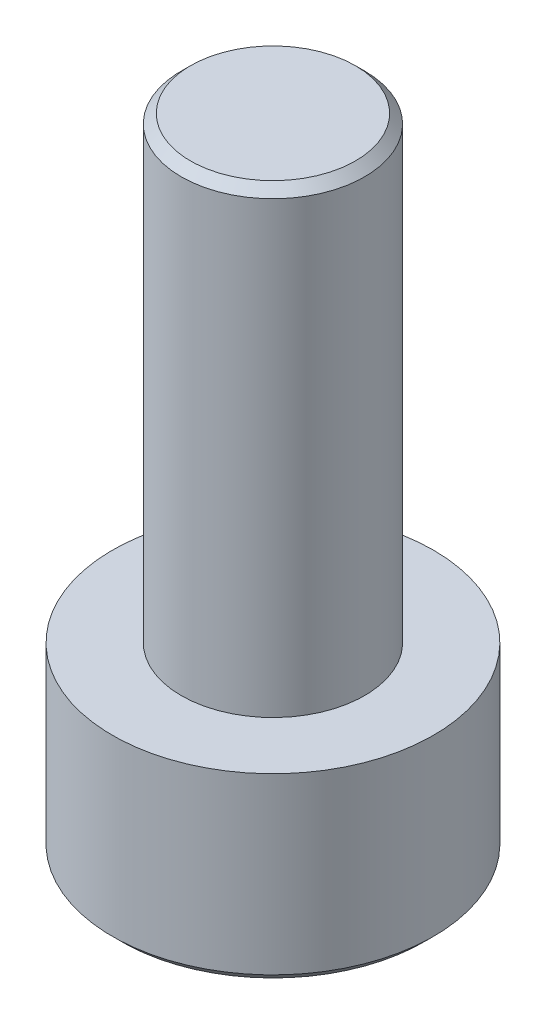
ISO-10303-21;
HEADER;
FILE_DESCRIPTION(('STEP AP214'),'2;1');
FILE_NAME('part.step','',(''),(''),'','','');
FILE_SCHEMA(('AUTOMOTIVE_DESIGN { 1 0 10303 214 1 1 1 1 }'));
ENDSEC;
DATA;
#1=APPLICATION_CONTEXT('core data for automotive mechanical design processes');
#2=APPLICATION_PROTOCOL_DEFINITION('international standard','automotive_design',2000,#1);
#3=PRODUCT_CONTEXT('',#1,'mechanical');
#4=PRODUCT('Part','Part','',(#3));
#5=PRODUCT_RELATED_PRODUCT_CATEGORY('part','',(#4));
#6=PRODUCT_DEFINITION_FORMATION('','',#4);
#7=PRODUCT_DEFINITION_CONTEXT('part definition',#1,'design');
#8=PRODUCT_DEFINITION('design','',#6,#7);
#9=PRODUCT_DEFINITION_SHAPE('','',#8);
#10=(LENGTH_UNIT() NAMED_UNIT(*) SI_UNIT(.MILLI.,.METRE.));
#11=(NAMED_UNIT(*) PLANE_ANGLE_UNIT() SI_UNIT($,.RADIAN.));
#12=(NAMED_UNIT(*) SI_UNIT($,.STERADIAN.) SOLID_ANGLE_UNIT());
#13=UNCERTAINTY_MEASURE_WITH_UNIT(LENGTH_MEASURE(1.E-05),#10,'distance_accuracy_value','');
#14=(GEOMETRIC_REPRESENTATION_CONTEXT(3) GLOBAL_UNCERTAINTY_ASSIGNED_CONTEXT((#13)) GLOBAL_UNIT_ASSIGNED_CONTEXT((#10,
#11,#12)) REPRESENTATION_CONTEXT('',''));
#15=CARTESIAN_POINT('',(0.,0.,0.));
#16=DIRECTION('',(0.,0.,1.));
#17=DIRECTION('',(1.,0.,0.));
#18=AXIS2_PLACEMENT_3D('',#15,#16,#17);
#19=CARTESIAN_POINT('',(0.,-4.,0.));
#20=DIRECTION('',(0.,-1.,0.));
#21=DIRECTION('',(0.,0.,-1.));
#22=AXIS2_PLACEMENT_3D('',#19,#20,#21);
#23=PLANE('',#22);
#24=CARTESIAN_POINT('',(0.,-4.,0.));
#25=DIRECTION('',(0.,-1.,0.));
#26=DIRECTION('',(0.,0.,-1.));
#27=AXIS2_PLACEMENT_3D('',#24,#25,#26);
#28=CIRCLE('',#27,3.3);
#29=CARTESIAN_POINT('',(0.,-4.,-3.3));
#30=VERTEX_POINT('',#29);
#31=EDGE_CURVE('E11',#30,#30,#28,.T.);
#32=ORIENTED_EDGE('',*,*,#31,.T.);
#33=EDGE_LOOP('',(#32));
#34=FACE_BOUND('',#33,.T.);
#35=DIRECTION('',(0.5,0.,-0.866025403784439));
#36=VECTOR('',#35,1.);
#37=CARTESIAN_POINT('',(1.73205080756888,-4.,0.));
#38=LINE('',#37,#36);
#39=CARTESIAN_POINT('',(0.866025403784439,-4.,1.5));
#40=VERTEX_POINT('',#39);
#41=CARTESIAN_POINT('',(1.73205080756888,-4.,0.));
#42=VERTEX_POINT('',#41);
#43=EDGE_CURVE('E131',#40,#42,#38,.T.);
#44=ORIENTED_EDGE('',*,*,#43,.T.);
#45=DIRECTION('',(-0.5,0.,-0.866025403784439));
#46=VECTOR('',#45,1.);
#47=CARTESIAN_POINT('',(0.866025403784439,-4.,-1.5));
#48=LINE('',#47,#46);
#49=CARTESIAN_POINT('',(0.866025403784439,-4.,-1.5));
#50=VERTEX_POINT('',#49);
#51=EDGE_CURVE('E51',#42,#50,#48,.T.);
#52=ORIENTED_EDGE('',*,*,#51,.T.);
#53=DIRECTION('',(-1.,0.,0.));
#54=VECTOR('',#53,1.);
#55=CARTESIAN_POINT('',(-0.866025403784439,-4.,-1.5));
#56=LINE('',#55,#54);
#57=CARTESIAN_POINT('',(-0.866025403784439,-4.,-1.5));
#58=VERTEX_POINT('',#57);
#59=EDGE_CURVE('E122',#50,#58,#56,.T.);
#60=ORIENTED_EDGE('',*,*,#59,.T.);
#61=DIRECTION('',(-0.5,0.,0.866025403784439));
#62=VECTOR('',#61,1.);
#63=CARTESIAN_POINT('',(-1.73205080756888,-4.,0.));
#64=LINE('',#63,#62);
#65=CARTESIAN_POINT('',(-1.73205080756888,-4.,0.));
#66=VERTEX_POINT('',#65);
#67=EDGE_CURVE('E125',#58,#66,#64,.T.);
#68=ORIENTED_EDGE('',*,*,#67,.T.);
#69=DIRECTION('',(0.5,0.,0.866025403784439));
#70=VECTOR('',#69,1.);
#71=CARTESIAN_POINT('',(-0.866025403784438,-4.,1.5));
#72=LINE('',#71,#70);
#73=CARTESIAN_POINT('',(-0.866025403784438,-4.,1.5));
#74=VERTEX_POINT('',#73);
#75=EDGE_CURVE('E128',#66,#74,#72,.T.);
#76=ORIENTED_EDGE('',*,*,#75,.T.);
#77=DIRECTION('',(1.,0.,0.));
#78=VECTOR('',#77,1.);
#79=CARTESIAN_POINT('',(0.866025403784439,-4.,1.5));
#80=LINE('',#79,#78);
#81=EDGE_CURVE('E112',#74,#40,#80,.T.);
#82=ORIENTED_EDGE('',*,*,#81,.T.);
#83=EDGE_LOOP('',(#44,#52,#60,#68,#76,#82));
#84=FACE_BOUND('',#83,.T.);
#85=ADVANCED_FACE('F37',(#34,#84),#23,.T.);
#86=CARTESIAN_POINT('',(0.,-4.,0.));
#87=DIRECTION('',(0.,1.,0.));
#88=DIRECTION('',(0.,0.,1.));
#89=AXIS2_PLACEMENT_3D('',#86,#87,#88);
#90=CONICAL_SURFACE('',#89,3.3,0.785398163397504);
#91=CARTESIAN_POINT('',(0.,-3.80000000000003,0.));
#92=DIRECTION('',(0.,-1.,0.));
#93=DIRECTION('',(0.,0.,-1.));
#94=AXIS2_PLACEMENT_3D('',#91,#92,#93);
#95=CIRCLE('',#94,3.5);
#96=CARTESIAN_POINT('',(0.,-3.80000000000003,-3.5));
#97=VERTEX_POINT('',#96);
#98=EDGE_CURVE('E44',#97,#97,#95,.T.);
#99=ORIENTED_EDGE('',*,*,#98,.T.);
#100=EDGE_LOOP('',(#99));
#101=FACE_BOUND('',#100,.T.);
#102=ORIENTED_EDGE('',*,*,#31,.F.);
#103=EDGE_LOOP('',(#102));
#104=FACE_BOUND('',#103,.T.);
#105=ADVANCED_FACE('F156',(#101,#104),#90,.T.);
#106=CARTESIAN_POINT('',(0.,-500.,0.));
#107=DIRECTION('',(0.,-1.,0.));
#108=DIRECTION('',(0.,0.,-1.));
#109=AXIS2_PLACEMENT_3D('',#106,#107,#108);
#110=CYLINDRICAL_SURFACE('',#109,3.5);
#111=CARTESIAN_POINT('',(0.,0.,0.));
#112=DIRECTION('',(0.,-1.,0.));
#113=DIRECTION('',(0.,0.,-1.));
#114=AXIS2_PLACEMENT_3D('',#111,#112,#113);
#115=CIRCLE('',#114,3.5);
#116=CARTESIAN_POINT('',(0.,0.,-3.5));
#117=VERTEX_POINT('',#116);
#118=EDGE_CURVE('E151',#117,#117,#115,.T.);
#119=ORIENTED_EDGE('',*,*,#118,.T.);
#120=EDGE_LOOP('',(#119));
#121=FACE_BOUND('',#120,.T.);
#122=ORIENTED_EDGE('',*,*,#98,.F.);
#123=EDGE_LOOP('',(#122));
#124=FACE_BOUND('',#123,.T.);
#125=ADVANCED_FACE('F159',(#121,#124),#110,.T.);
#126=CARTESIAN_POINT('',(3.5,0.,0.));
#127=DIRECTION('',(0.,1.,0.));
#128=DIRECTION('',(0.,0.,1.));
#129=AXIS2_PLACEMENT_3D('',#126,#127,#128);
#130=PLANE('',#129);
#131=CARTESIAN_POINT('',(0.,0.,0.));
#132=DIRECTION('',(0.,-1.,0.));
#133=DIRECTION('',(0.,0.,-1.));
#134=AXIS2_PLACEMENT_3D('',#131,#132,#133);
#135=CIRCLE('',#134,2.);
#136=CARTESIAN_POINT('',(0.,0.,-2.));
#137=VERTEX_POINT('',#136);
#138=EDGE_CURVE('E148',#137,#137,#135,.T.);
#139=ORIENTED_EDGE('',*,*,#138,.T.);
#140=EDGE_LOOP('',(#139));
#141=FACE_BOUND('',#140,.T.);
#142=ORIENTED_EDGE('',*,*,#118,.F.);
#143=EDGE_LOOP('',(#142));
#144=FACE_BOUND('',#143,.T.);
#145=ADVANCED_FACE('F161',(#141,#144),#130,.T.);
#146=CARTESIAN_POINT('',(0.,-500.,0.));
#147=DIRECTION('',(0.,-1.,0.));
#148=DIRECTION('',(0.,0.,-1.));
#149=AXIS2_PLACEMENT_3D('',#146,#147,#148);
#150=CYLINDRICAL_SURFACE('',#149,2.);
#151=CARTESIAN_POINT('',(0.,9.80000000000003,0.));
#152=DIRECTION('',(0.,-1.,0.));
#153=DIRECTION('',(0.,0.,-1.));
#154=AXIS2_PLACEMENT_3D('',#151,#152,#153);
#155=CIRCLE('',#154,2.);
#156=CARTESIAN_POINT('',(0.,9.80000000000003,-2.));
#157=VERTEX_POINT('',#156);
#158=EDGE_CURVE('E145',#157,#157,#155,.T.);
#159=ORIENTED_EDGE('',*,*,#158,.T.);
#160=EDGE_LOOP('',(#159));
#161=FACE_BOUND('',#160,.T.);
#162=ORIENTED_EDGE('',*,*,#138,.F.);
#163=EDGE_LOOP('',(#162));
#164=FACE_BOUND('',#163,.T.);
#165=ADVANCED_FACE('F168',(#161,#164),#150,.T.);
#166=CARTESIAN_POINT('',(0.,9.80000000000003,0.));
#167=DIRECTION('',(0.,-1.,0.));
#168=DIRECTION('',(0.,0.,-1.));
#169=AXIS2_PLACEMENT_3D('',#166,#167,#168);
#170=CONICAL_SURFACE('',#169,2.,0.785398163397504);
#171=CARTESIAN_POINT('',(0.,10.,0.));
#172=DIRECTION('',(0.,-1.,0.));
#173=DIRECTION('',(0.,0.,-1.));
#174=AXIS2_PLACEMENT_3D('',#171,#172,#173);
#175=CIRCLE('',#174,1.8);
#176=CARTESIAN_POINT('',(0.,10.,-1.8));
#177=VERTEX_POINT('',#176);
#178=EDGE_CURVE('E142',#177,#177,#175,.T.);
#179=ORIENTED_EDGE('',*,*,#178,.T.);
#180=EDGE_LOOP('',(#179));
#181=FACE_BOUND('',#180,.T.);
#182=ORIENTED_EDGE('',*,*,#158,.F.);
#183=EDGE_LOOP('',(#182));
#184=FACE_BOUND('',#183,.T.);
#185=ADVANCED_FACE('F201',(#181,#184),#170,.T.);
#186=CARTESIAN_POINT('',(1.8,10.,0.));
#187=DIRECTION('',(0.,1.,0.));
#188=DIRECTION('',(0.,0.,1.));
#189=AXIS2_PLACEMENT_3D('',#186,#187,#188);
#190=PLANE('',#189);
#191=ORIENTED_EDGE('',*,*,#178,.F.);
#192=EDGE_LOOP('',(#191));
#193=FACE_BOUND('',#192,.T.);
#194=ADVANCED_FACE('F195',(#193),#190,.T.);
#195=CARTESIAN_POINT('',(0.866025403784439,-2.,-1.5));
#196=DIRECTION('',(-0.866025403784439,0.,0.5));
#197=DIRECTION('',(0.5,0.,0.866025403784439));
#198=AXIS2_PLACEMENT_3D('',#195,#196,#197);
#199=PLANE('',#198);
#200=ORIENTED_EDGE('',*,*,#51,.F.);
#201=DIRECTION('',(0.,-1.,0.));
#202=VECTOR('',#201,1.);
#203=CARTESIAN_POINT('',(1.73205080756888,-2.,0.));
#204=LINE('',#203,#202);
#205=CARTESIAN_POINT('',(1.73205080756888,-2.,0.));
#206=VERTEX_POINT('',#205);
#207=EDGE_CURVE('E117',#206,#42,#204,.T.);
#208=ORIENTED_EDGE('',*,*,#207,.F.);
#209=DIRECTION('',(-0.5,0.,-0.866025403784439));
#210=VECTOR('',#209,1.);
#211=CARTESIAN_POINT('',(0.866025403784439,-2.,-1.5));
#212=LINE('',#211,#210);
#213=CARTESIAN_POINT('',(0.866025403784439,-2.,-1.5));
#214=VERTEX_POINT('',#213);
#215=EDGE_CURVE('E134',#206,#214,#212,.T.);
#216=ORIENTED_EDGE('',*,*,#215,.T.);
#217=DIRECTION('',(0.,-1.,0.));
#218=VECTOR('',#217,1.);
#219=CARTESIAN_POINT('',(0.866025403784439,-2.,-1.5));
#220=LINE('',#219,#218);
#221=EDGE_CURVE('E140',#214,#50,#220,.T.);
#222=ORIENTED_EDGE('',*,*,#221,.T.);
#223=EDGE_LOOP('',(#200,#208,#216,#222));
#224=FACE_BOUND('',#223,.T.);
#225=ADVANCED_FACE('F178',(#224),#199,.T.);
#226=CARTESIAN_POINT('',(-0.866025403784439,-2.,-1.5));
#227=DIRECTION('',(0.,0.,1.));
#228=DIRECTION('',(1.,0.,0.));
#229=AXIS2_PLACEMENT_3D('',#226,#227,#228);
#230=PLANE('',#229);
#231=ORIENTED_EDGE('',*,*,#59,.F.);
#232=ORIENTED_EDGE('',*,*,#221,.F.);
#233=DIRECTION('',(-1.,0.,0.));
#234=VECTOR('',#233,1.);
#235=CARTESIAN_POINT('',(-0.866025403784439,-2.,-1.5));
#236=LINE('',#235,#234);
#237=CARTESIAN_POINT('',(-0.866025403784439,-2.,-1.5));
#238=VERTEX_POINT('',#237);
#239=EDGE_CURVE('E90',#214,#238,#236,.T.);
#240=ORIENTED_EDGE('',*,*,#239,.T.);
#241=DIRECTION('',(0.,-1.,0.));
#242=VECTOR('',#241,1.);
#243=CARTESIAN_POINT('',(-0.866025403784439,-2.,-1.5));
#244=LINE('',#243,#242);
#245=EDGE_CURVE('E138',#238,#58,#244,.T.);
#246=ORIENTED_EDGE('',*,*,#245,.T.);
#247=EDGE_LOOP('',(#231,#232,#240,#246));
#248=FACE_BOUND('',#247,.T.);
#249=ADVANCED_FACE('F187',(#248),#230,.T.);
#250=CARTESIAN_POINT('',(-1.73205080756888,-2.,0.));
#251=DIRECTION('',(0.866025403784439,0.,0.5));
#252=DIRECTION('',(0.5,0.,-0.866025403784439));
#253=AXIS2_PLACEMENT_3D('',#250,#251,#252);
#254=PLANE('',#253);
#255=ORIENTED_EDGE('',*,*,#67,.F.);
#256=ORIENTED_EDGE('',*,*,#245,.F.);
#257=DIRECTION('',(-0.5,0.,0.866025403784439));
#258=VECTOR('',#257,1.);
#259=CARTESIAN_POINT('',(-1.73205080756888,-2.,0.));
#260=LINE('',#259,#258);
#261=CARTESIAN_POINT('',(-1.73205080756888,-2.,0.));
#262=VERTEX_POINT('',#261);
#263=EDGE_CURVE('E108',#238,#262,#260,.T.);
#264=ORIENTED_EDGE('',*,*,#263,.T.);
#265=DIRECTION('',(0.,-1.,0.));
#266=VECTOR('',#265,1.);
#267=CARTESIAN_POINT('',(-1.73205080756888,-2.,0.));
#268=LINE('',#267,#266);
#269=EDGE_CURVE('E105',#262,#66,#268,.T.);
#270=ORIENTED_EDGE('',*,*,#269,.T.);
#271=EDGE_LOOP('',(#255,#256,#264,#270));
#272=FACE_BOUND('',#271,.T.);
#273=ADVANCED_FACE('F185',(#272),#254,.T.);
#274=CARTESIAN_POINT('',(-0.866025403784438,-2.,1.5));
#275=DIRECTION('',(0.866025403784439,0.,-0.5));
#276=DIRECTION('',(-0.5,0.,-0.866025403784439));
#277=AXIS2_PLACEMENT_3D('',#274,#275,#276);
#278=PLANE('',#277);
#279=ORIENTED_EDGE('',*,*,#75,.F.);
#280=ORIENTED_EDGE('',*,*,#269,.F.);
#281=DIRECTION('',(0.5,0.,0.866025403784439));
#282=VECTOR('',#281,1.);
#283=CARTESIAN_POINT('',(-0.866025403784438,-2.,1.5));
#284=LINE('',#283,#282);
#285=CARTESIAN_POINT('',(-0.866025403784438,-2.,1.5));
#286=VERTEX_POINT('',#285);
#287=EDGE_CURVE('E100',#262,#286,#284,.T.);
#288=ORIENTED_EDGE('',*,*,#287,.T.);
#289=DIRECTION('',(0.,-1.,0.));
#290=VECTOR('',#289,1.);
#291=CARTESIAN_POINT('',(-0.866025403784438,-2.,1.5));
#292=LINE('',#291,#290);
#293=EDGE_CURVE('E104',#286,#74,#292,.T.);
#294=ORIENTED_EDGE('',*,*,#293,.T.);
#295=EDGE_LOOP('',(#279,#280,#288,#294));
#296=FACE_BOUND('',#295,.T.);
#297=ADVANCED_FACE('F103',(#296),#278,.T.);
#298=CARTESIAN_POINT('',(0.866025403784439,-2.,1.5));
#299=DIRECTION('',(0.,0.,-1.));
#300=DIRECTION('',(-1.,0.,0.));
#301=AXIS2_PLACEMENT_3D('',#298,#299,#300);
#302=PLANE('',#301);
#303=ORIENTED_EDGE('',*,*,#81,.F.);
#304=ORIENTED_EDGE('',*,*,#293,.F.);
#305=DIRECTION('',(1.,0.,0.));
#306=VECTOR('',#305,1.);
#307=CARTESIAN_POINT('',(0.866025403784439,-2.,1.5));
#308=LINE('',#307,#306);
#309=CARTESIAN_POINT('',(0.866025403784439,-2.,1.5));
#310=VERTEX_POINT('',#309);
#311=EDGE_CURVE('E107',#286,#310,#308,.T.);
#312=ORIENTED_EDGE('',*,*,#311,.T.);
#313=DIRECTION('',(0.,-1.,0.));
#314=VECTOR('',#313,1.);
#315=CARTESIAN_POINT('',(0.866025403784439,-2.,1.5));
#316=LINE('',#315,#314);
#317=EDGE_CURVE('E81',#310,#40,#316,.T.);
#318=ORIENTED_EDGE('',*,*,#317,.T.);
#319=EDGE_LOOP('',(#303,#304,#312,#318));
#320=FACE_BOUND('',#319,.T.);
#321=ADVANCED_FACE('F110',(#320),#302,.T.);
#322=CARTESIAN_POINT('',(1.73205080756888,-2.,0.));
#323=DIRECTION('',(-0.866025403784439,0.,-0.5));
#324=DIRECTION('',(-0.5,0.,0.866025403784439));
#325=AXIS2_PLACEMENT_3D('',#322,#323,#324);
#326=PLANE('',#325);
#327=ORIENTED_EDGE('',*,*,#43,.F.);
#328=ORIENTED_EDGE('',*,*,#317,.F.);
#329=DIRECTION('',(0.5,0.,-0.866025403784439));
#330=VECTOR('',#329,1.);
#331=CARTESIAN_POINT('',(1.73205080756888,-2.,0.));
#332=LINE('',#331,#330);
#333=EDGE_CURVE('E59',#310,#206,#332,.T.);
#334=ORIENTED_EDGE('',*,*,#333,.T.);
#335=ORIENTED_EDGE('',*,*,#207,.T.);
#336=EDGE_LOOP('',(#327,#328,#334,#335));
#337=FACE_BOUND('',#336,.T.);
#338=ADVANCED_FACE('F177',(#337),#326,.T.);
#339=CARTESIAN_POINT('',(0.,-2.,0.));
#340=DIRECTION('',(0.,-1.,0.));
#341=DIRECTION('',(0.,0.,-1.));
#342=AXIS2_PLACEMENT_3D('',#339,#340,#341);
#343=PLANE('',#342);
#344=ORIENTED_EDGE('',*,*,#215,.F.);
#345=ORIENTED_EDGE('',*,*,#333,.F.);
#346=ORIENTED_EDGE('',*,*,#311,.F.);
#347=ORIENTED_EDGE('',*,*,#287,.F.);
#348=ORIENTED_EDGE('',*,*,#263,.F.);
#349=ORIENTED_EDGE('',*,*,#239,.F.);
#350=EDGE_LOOP('',(#344,#345,#346,#347,#348,#349));
#351=FACE_BOUND('',#350,.T.);
#352=ADVANCED_FACE('F115',(#351),#343,.T.);
#353=CLOSED_SHELL('',(#85,#105,#125,#145,#165,#185,#194,#225,#249,#273,#297,#321,#338,#352));
#354=MANIFOLD_SOLID_BREP('B2',#353);
#355=ADVANCED_BREP_SHAPE_REPRESENTATION('',(#18,#354),#14);
#356=SHAPE_DEFINITION_REPRESENTATION(#9,#355);
ENDSEC;
END-ISO-10303-21;
